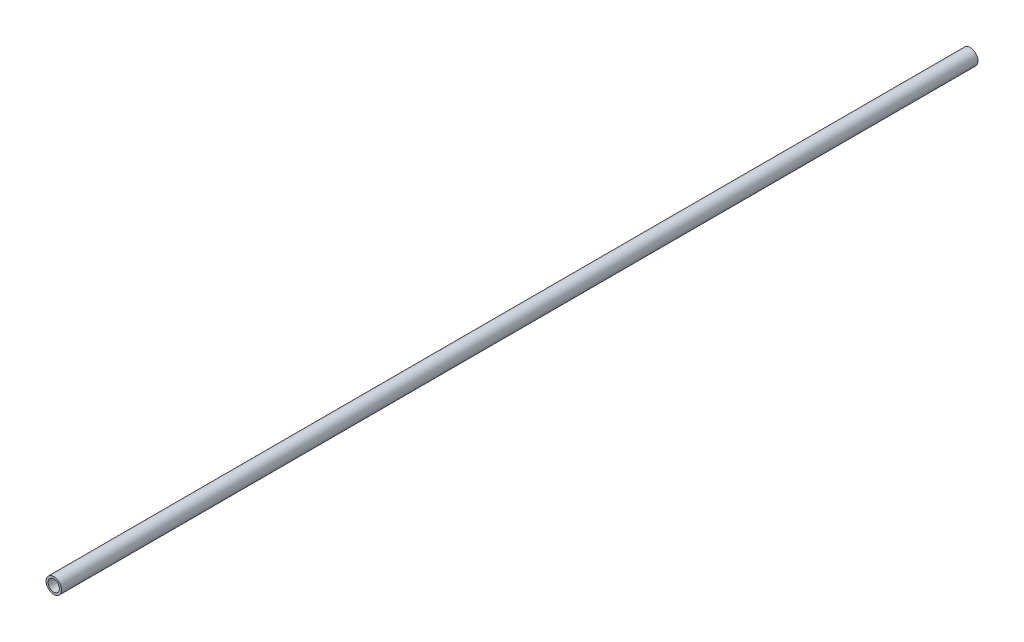
ISO-10303-21;
HEADER;
FILE_DESCRIPTION(('STEP AP214'),'2;1');
FILE_NAME('part.step','',(''),(''),'','','');
FILE_SCHEMA(('AUTOMOTIVE_DESIGN { 1 0 10303 214 1 1 1 1 }'));
ENDSEC;
DATA;
#1=APPLICATION_CONTEXT('core data for automotive mechanical design processes');
#2=APPLICATION_PROTOCOL_DEFINITION('international standard','automotive_design',2000,#1);
#3=PRODUCT_CONTEXT('',#1,'mechanical');
#4=PRODUCT('Part','Part','',(#3));
#5=PRODUCT_RELATED_PRODUCT_CATEGORY('part','',(#4));
#6=PRODUCT_DEFINITION_FORMATION('','',#4);
#7=PRODUCT_DEFINITION_CONTEXT('part definition',#1,'design');
#8=PRODUCT_DEFINITION('design','',#6,#7);
#9=PRODUCT_DEFINITION_SHAPE('','',#8);
#10=(LENGTH_UNIT() NAMED_UNIT(*) SI_UNIT(.MILLI.,.METRE.));
#11=(NAMED_UNIT(*) PLANE_ANGLE_UNIT() SI_UNIT($,.RADIAN.));
#12=(NAMED_UNIT(*) SI_UNIT($,.STERADIAN.) SOLID_ANGLE_UNIT());
#13=UNCERTAINTY_MEASURE_WITH_UNIT(LENGTH_MEASURE(1.E-05),#10,'distance_accuracy_value','');
#14=(GEOMETRIC_REPRESENTATION_CONTEXT(3) GLOBAL_UNCERTAINTY_ASSIGNED_CONTEXT((#13)) GLOBAL_UNIT_ASSIGNED_CONTEXT((#10,
#11,#12)) REPRESENTATION_CONTEXT('',''));
#15=CARTESIAN_POINT('',(0.,0.,0.));
#16=DIRECTION('',(0.,0.,1.));
#17=DIRECTION('',(1.,0.,0.));
#18=AXIS2_PLACEMENT_3D('',#15,#16,#17);
#19=CARTESIAN_POINT('',(0.,0.,0.));
#20=DIRECTION('',(0.,0.,-1.));
#21=DIRECTION('',(0.,-1.,0.));
#22=AXIS2_PLACEMENT_3D('',#19,#20,#21);
#23=CYLINDRICAL_SURFACE('',#22,6.2611);
#24=CARTESIAN_POINT('',(0.,0.,-1009.65));
#25=DIRECTION('',(0.,0.,1.));
#26=DIRECTION('',(1.,0.,0.));
#27=AXIS2_PLACEMENT_3D('',#24,#25,#26);
#28=CIRCLE('',#27,6.2611);
#29=CARTESIAN_POINT('',(6.2611,0.,-1009.65));
#30=VERTEX_POINT('',#29);
#31=EDGE_CURVE('E24',#30,#30,#28,.T.);
#32=ORIENTED_EDGE('',*,*,#31,.F.);
#33=EDGE_LOOP('',(#32));
#34=FACE_BOUND('',#33,.T.);
#35=CARTESIAN_POINT('',(0.,0.,0.));
#36=DIRECTION('',(0.,0.,-1.));
#37=DIRECTION('',(0.,-1.,0.));
#38=AXIS2_PLACEMENT_3D('',#35,#36,#37);
#39=CIRCLE('',#38,6.2611);
#40=CARTESIAN_POINT('',(0.,-6.2611,0.));
#41=VERTEX_POINT('',#40);
#42=EDGE_CURVE('E28',#41,#41,#39,.T.);
#43=ORIENTED_EDGE('',*,*,#42,.F.);
#44=EDGE_LOOP('',(#43));
#45=FACE_BOUND('',#44,.T.);
#46=ADVANCED_FACE('F14',(#34,#45),#23,.F.);
#47=CARTESIAN_POINT('',(0.,0.,0.));
#48=DIRECTION('',(0.,0.,-1.));
#49=DIRECTION('',(0.,-1.,0.));
#50=AXIS2_PLACEMENT_3D('',#47,#48,#49);
#51=CYLINDRICAL_SURFACE('',#50,8.5725);
#52=CARTESIAN_POINT('',(0.,0.,-1009.65));
#53=DIRECTION('',(0.,0.,-1.));
#54=DIRECTION('',(0.,-1.,0.));
#55=AXIS2_PLACEMENT_3D('',#52,#53,#54);
#56=CIRCLE('',#55,8.5725);
#57=CARTESIAN_POINT('',(0.,-8.5725,-1009.65));
#58=VERTEX_POINT('',#57);
#59=EDGE_CURVE('E20',#58,#58,#56,.T.);
#60=ORIENTED_EDGE('',*,*,#59,.F.);
#61=EDGE_LOOP('',(#60));
#62=FACE_BOUND('',#61,.T.);
#63=CARTESIAN_POINT('',(0.,0.,0.));
#64=DIRECTION('',(0.,0.,-1.));
#65=DIRECTION('',(0.,-1.,0.));
#66=AXIS2_PLACEMENT_3D('',#63,#64,#65);
#67=CIRCLE('',#66,8.5725);
#68=CARTESIAN_POINT('',(0.,-8.5725,0.));
#69=VERTEX_POINT('',#68);
#70=EDGE_CURVE('E9',#69,#69,#67,.T.);
#71=ORIENTED_EDGE('',*,*,#70,.T.);
#72=EDGE_LOOP('',(#71));
#73=FACE_BOUND('',#72,.T.);
#74=ADVANCED_FACE('F37',(#62,#73),#51,.T.);
#75=CARTESIAN_POINT('',(0.,0.,-1009.65));
#76=DIRECTION('',(0.,0.,1.));
#77=DIRECTION('',(1.,0.,0.));
#78=AXIS2_PLACEMENT_3D('',#75,#76,#77);
#79=PLANE('',#78);
#80=ORIENTED_EDGE('',*,*,#59,.T.);
#81=EDGE_LOOP('',(#80));
#82=FACE_BOUND('',#81,.T.);
#83=ORIENTED_EDGE('',*,*,#31,.T.);
#84=EDGE_LOOP('',(#83));
#85=FACE_BOUND('',#84,.T.);
#86=ADVANCED_FACE('F43',(#82,#85),#79,.F.);
#87=CARTESIAN_POINT('',(0.,0.,0.));
#88=DIRECTION('',(0.,0.,1.));
#89=DIRECTION('',(1.,0.,0.));
#90=AXIS2_PLACEMENT_3D('',#87,#88,#89);
#91=PLANE('',#90);
#92=ORIENTED_EDGE('',*,*,#70,.F.);
#93=EDGE_LOOP('',(#92));
#94=FACE_BOUND('',#93,.T.);
#95=ORIENTED_EDGE('',*,*,#42,.T.);
#96=EDGE_LOOP('',(#95));
#97=FACE_BOUND('',#96,.T.);
#98=ADVANCED_FACE('F34',(#94,#97),#91,.T.);
#99=CLOSED_SHELL('',(#46,#74,#86,#98));
#100=MANIFOLD_SOLID_BREP('B1',#99);
#101=ADVANCED_BREP_SHAPE_REPRESENTATION('',(#18,#100),#14);
#102=SHAPE_DEFINITION_REPRESENTATION(#9,#101);
ENDSEC;
END-ISO-10303-21;
